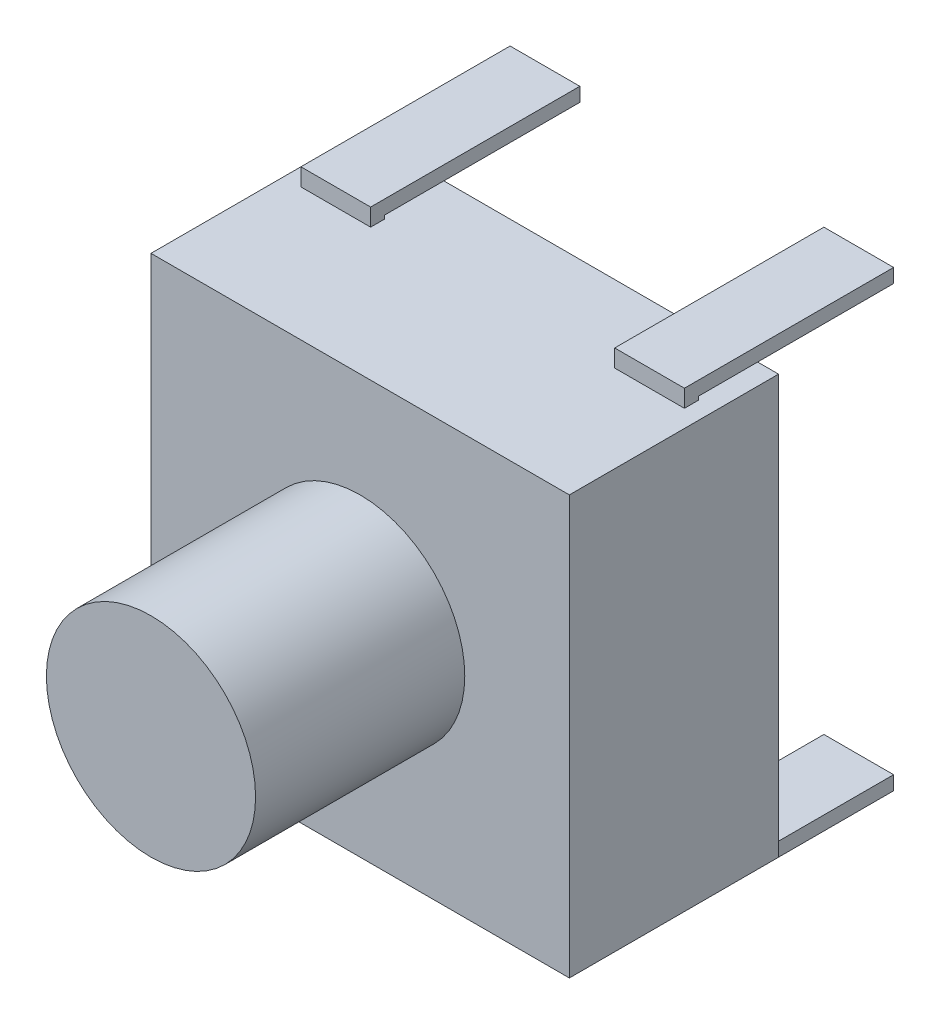
ISO-10303-21;
HEADER;
FILE_DESCRIPTION(('STEP AP214'),'2;1');
FILE_NAME('part.step','',(''),(''),'','','');
FILE_SCHEMA(('AUTOMOTIVE_DESIGN { 1 0 10303 214 1 1 1 1 }'));
ENDSEC;
DATA;
#1=APPLICATION_CONTEXT('core data for automotive mechanical design processes');
#2=APPLICATION_PROTOCOL_DEFINITION('international standard','automotive_design',2000,#1);
#3=PRODUCT_CONTEXT('',#1,'mechanical');
#4=PRODUCT('Part','Part','',(#3));
#5=PRODUCT_RELATED_PRODUCT_CATEGORY('part','',(#4));
#6=PRODUCT_DEFINITION_FORMATION('','',#4);
#7=PRODUCT_DEFINITION_CONTEXT('part definition',#1,'design');
#8=PRODUCT_DEFINITION('design','',#6,#7);
#9=PRODUCT_DEFINITION_SHAPE('','',#8);
#10=(LENGTH_UNIT() NAMED_UNIT(*) SI_UNIT(.MILLI.,.METRE.));
#11=(NAMED_UNIT(*) PLANE_ANGLE_UNIT() SI_UNIT($,.RADIAN.));
#12=(NAMED_UNIT(*) SI_UNIT($,.STERADIAN.) SOLID_ANGLE_UNIT());
#13=UNCERTAINTY_MEASURE_WITH_UNIT(LENGTH_MEASURE(1.E-05),#10,'distance_accuracy_value','');
#14=(GEOMETRIC_REPRESENTATION_CONTEXT(3) GLOBAL_UNCERTAINTY_ASSIGNED_CONTEXT((#13)) GLOBAL_UNIT_ASSIGNED_CONTEXT((#10,
#11,#12)) REPRESENTATION_CONTEXT('',''));
#15=CARTESIAN_POINT('',(0.,0.,0.));
#16=DIRECTION('',(0.,0.,1.));
#17=DIRECTION('',(1.,0.,0.));
#18=AXIS2_PLACEMENT_3D('',#15,#16,#17);
#19=CARTESIAN_POINT('',(-3.00000000000002,3.,3.));
#20=DIRECTION('',(0.,-1.,0.));
#21=DIRECTION('',(0.,0.,-1.));
#22=AXIS2_PLACEMENT_3D('',#19,#20,#21);
#23=PLANE('',#22);
#24=DIRECTION('',(0.,0.,-1.));
#25=VECTOR('',#24,1.);
#26=CARTESIAN_POINT('',(1.75,3.,1.1));
#27=LINE('',#26,#25);
#28=CARTESIAN_POINT('',(1.75,3.,1.1));
#29=VERTEX_POINT('',#28);
#30=CARTESIAN_POINT('',(1.75,3.,0.9));
#31=VERTEX_POINT('',#30);
#32=EDGE_CURVE('E247',#29,#31,#27,.T.);
#33=ORIENTED_EDGE('',*,*,#32,.T.);
#34=DIRECTION('',(1.,0.,0.));
#35=VECTOR('',#34,1.);
#36=CARTESIAN_POINT('',(1.75,3.,0.9));
#37=LINE('',#36,#35);
#38=CARTESIAN_POINT('',(2.75,3.,0.9));
#39=VERTEX_POINT('',#38);
#40=EDGE_CURVE('E59',#31,#39,#37,.T.);
#41=ORIENTED_EDGE('',*,*,#40,.T.);
#42=DIRECTION('',(0.,0.,1.));
#43=VECTOR('',#42,1.);
#44=CARTESIAN_POINT('',(2.75,3.,1.1));
#45=LINE('',#44,#43);
#46=CARTESIAN_POINT('',(2.75,3.,1.1));
#47=VERTEX_POINT('',#46);
#48=EDGE_CURVE('E254',#39,#47,#45,.T.);
#49=ORIENTED_EDGE('',*,*,#48,.T.);
#50=DIRECTION('',(-1.,0.,0.));
#51=VECTOR('',#50,1.);
#52=CARTESIAN_POINT('',(1.75,3.,1.1));
#53=LINE('',#52,#51);
#54=EDGE_CURVE('E236',#47,#29,#53,.T.);
#55=ORIENTED_EDGE('',*,*,#54,.T.);
#56=EDGE_LOOP('',(#33,#41,#49,#55));
#57=FACE_BOUND('',#56,.T.);
#58=DIRECTION('',(-1.,0.,0.));
#59=VECTOR('',#58,1.);
#60=CARTESIAN_POINT('',(-3.00000000000002,3.,0.));
#61=LINE('',#60,#59);
#62=CARTESIAN_POINT('',(3.,3.,0.));
#63=VERTEX_POINT('',#62);
#64=CARTESIAN_POINT('',(-3.00000000000002,3.,0.));
#65=VERTEX_POINT('',#64);
#66=EDGE_CURVE('E524',#63,#65,#61,.T.);
#67=ORIENTED_EDGE('',*,*,#66,.T.);
#68=DIRECTION('',(0.,0.,-1.));
#69=VECTOR('',#68,1.);
#70=CARTESIAN_POINT('',(-3.00000000000002,3.,3.));
#71=LINE('',#70,#69);
#72=CARTESIAN_POINT('',(-3.00000000000002,3.,3.));
#73=VERTEX_POINT('',#72);
#74=EDGE_CURVE('E532',#73,#65,#71,.T.);
#75=ORIENTED_EDGE('',*,*,#74,.F.);
#76=DIRECTION('',(-1.,0.,0.));
#77=VECTOR('',#76,1.);
#78=CARTESIAN_POINT('',(-3.00000000000002,3.,3.));
#79=LINE('',#78,#77);
#80=CARTESIAN_POINT('',(3.,3.,3.));
#81=VERTEX_POINT('',#80);
#82=EDGE_CURVE('E511',#81,#73,#79,.T.);
#83=ORIENTED_EDGE('',*,*,#82,.F.);
#84=DIRECTION('',(0.,0.,-1.));
#85=VECTOR('',#84,1.);
#86=CARTESIAN_POINT('',(3.,3.,3.));
#87=LINE('',#86,#85);
#88=EDGE_CURVE('E536',#81,#63,#87,.T.);
#89=ORIENTED_EDGE('',*,*,#88,.T.);
#90=EDGE_LOOP('',(#67,#75,#83,#89));
#91=FACE_BOUND('',#90,.T.);
#92=DIRECTION('',(0.,0.,-1.));
#93=VECTOR('',#92,1.);
#94=CARTESIAN_POINT('',(-1.75,3.,1.1));
#95=LINE('',#94,#93);
#96=CARTESIAN_POINT('',(-1.75,3.,1.1));
#97=VERTEX_POINT('',#96);
#98=CARTESIAN_POINT('',(-1.75,3.,0.9));
#99=VERTEX_POINT('',#98);
#100=EDGE_CURVE('E67',#97,#99,#95,.T.);
#101=ORIENTED_EDGE('',*,*,#100,.F.);
#102=DIRECTION('',(1.,0.,0.));
#103=VECTOR('',#102,1.);
#104=CARTESIAN_POINT('',(-1.75,3.,1.1));
#105=LINE('',#104,#103);
#106=CARTESIAN_POINT('',(-2.75,3.,1.1));
#107=VERTEX_POINT('',#106);
#108=EDGE_CURVE('E321',#107,#97,#105,.T.);
#109=ORIENTED_EDGE('',*,*,#108,.F.);
#110=DIRECTION('',(0.,0.,1.));
#111=VECTOR('',#110,1.);
#112=CARTESIAN_POINT('',(-2.75,3.,1.1));
#113=LINE('',#112,#111);
#114=CARTESIAN_POINT('',(-2.75,3.,0.9));
#115=VERTEX_POINT('',#114);
#116=EDGE_CURVE('E317',#115,#107,#113,.T.);
#117=ORIENTED_EDGE('',*,*,#116,.F.);
#118=DIRECTION('',(-1.,0.,0.));
#119=VECTOR('',#118,1.);
#120=CARTESIAN_POINT('',(-1.75,3.,0.9));
#121=LINE('',#120,#119);
#122=EDGE_CURVE('E292',#99,#115,#121,.T.);
#123=ORIENTED_EDGE('',*,*,#122,.F.);
#124=EDGE_LOOP('',(#101,#109,#117,#123));
#125=FACE_BOUND('',#124,.T.);
#126=ADVANCED_FACE('F43',(#57,#91,#125),#23,.F.);
#127=CARTESIAN_POINT('',(-3.00000000000002,-3.,3.));
#128=DIRECTION('',(0.,1.,0.));
#129=DIRECTION('',(0.,0.,1.));
#130=AXIS2_PLACEMENT_3D('',#127,#128,#129);
#131=PLANE('',#130);
#132=DIRECTION('',(0.,0.,-1.));
#133=VECTOR('',#132,1.);
#134=CARTESIAN_POINT('',(-1.75,-3.,1.1));
#135=LINE('',#134,#133);
#136=CARTESIAN_POINT('',(-1.75,-3.,1.1));
#137=VERTEX_POINT('',#136);
#138=CARTESIAN_POINT('',(-1.75,-3.,0.9));
#139=VERTEX_POINT('',#138);
#140=EDGE_CURVE('E383',#137,#139,#135,.T.);
#141=ORIENTED_EDGE('',*,*,#140,.T.);
#142=DIRECTION('',(-1.,0.,0.));
#143=VECTOR('',#142,1.);
#144=CARTESIAN_POINT('',(-1.75,-3.,0.9));
#145=LINE('',#144,#143);
#146=CARTESIAN_POINT('',(-2.75,-3.,0.9));
#147=VERTEX_POINT('',#146);
#148=EDGE_CURVE('E298',#139,#147,#145,.T.);
#149=ORIENTED_EDGE('',*,*,#148,.T.);
#150=DIRECTION('',(0.,0.,1.));
#151=VECTOR('',#150,1.);
#152=CARTESIAN_POINT('',(-2.75,-3.,1.1));
#153=LINE('',#152,#151);
#154=CARTESIAN_POINT('',(-2.75,-3.,1.1));
#155=VERTEX_POINT('',#154);
#156=EDGE_CURVE('E390',#147,#155,#153,.T.);
#157=ORIENTED_EDGE('',*,*,#156,.T.);
#158=DIRECTION('',(1.,0.,0.));
#159=VECTOR('',#158,1.);
#160=CARTESIAN_POINT('',(-1.75,-3.,1.1));
#161=LINE('',#160,#159);
#162=EDGE_CURVE('E387',#155,#137,#161,.T.);
#163=ORIENTED_EDGE('',*,*,#162,.T.);
#164=EDGE_LOOP('',(#141,#149,#157,#163));
#165=FACE_BOUND('',#164,.T.);
#166=DIRECTION('',(1.,0.,0.));
#167=VECTOR('',#166,1.);
#168=CARTESIAN_POINT('',(-3.00000000000002,-3.,0.));
#169=LINE('',#168,#167);
#170=CARTESIAN_POINT('',(-3.00000000000002,-3.,0.));
#171=VERTEX_POINT('',#170);
#172=CARTESIAN_POINT('',(3.,-3.,0.));
#173=VERTEX_POINT('',#172);
#174=EDGE_CURVE('E502',#171,#173,#169,.T.);
#175=ORIENTED_EDGE('',*,*,#174,.T.);
#176=DIRECTION('',(0.,0.,-1.));
#177=VECTOR('',#176,1.);
#178=CARTESIAN_POINT('',(3.,-3.,3.));
#179=LINE('',#178,#177);
#180=CARTESIAN_POINT('',(3.,-3.,3.));
#181=VERTEX_POINT('',#180);
#182=EDGE_CURVE('E52',#181,#173,#179,.T.);
#183=ORIENTED_EDGE('',*,*,#182,.F.);
#184=DIRECTION('',(1.,0.,0.));
#185=VECTOR('',#184,1.);
#186=CARTESIAN_POINT('',(-3.00000000000002,-3.,3.));
#187=LINE('',#186,#185);
#188=CARTESIAN_POINT('',(-3.00000000000002,-3.,3.));
#189=VERTEX_POINT('',#188);
#190=EDGE_CURVE('E503',#189,#181,#187,.T.);
#191=ORIENTED_EDGE('',*,*,#190,.F.);
#192=DIRECTION('',(0.,0.,-1.));
#193=VECTOR('',#192,1.);
#194=CARTESIAN_POINT('',(-3.00000000000002,-3.,3.));
#195=LINE('',#194,#193);
#196=EDGE_CURVE('E517',#189,#171,#195,.T.);
#197=ORIENTED_EDGE('',*,*,#196,.T.);
#198=EDGE_LOOP('',(#175,#183,#191,#197));
#199=FACE_BOUND('',#198,.T.);
#200=DIRECTION('',(1.,0.,0.));
#201=VECTOR('',#200,1.);
#202=CARTESIAN_POINT('',(1.75,-3.,0.9));
#203=LINE('',#202,#201);
#204=CARTESIAN_POINT('',(1.75,-3.,0.9));
#205=VERTEX_POINT('',#204);
#206=CARTESIAN_POINT('',(2.75,-3.,0.9));
#207=VERTEX_POINT('',#206);
#208=EDGE_CURVE('E426',#205,#207,#203,.T.);
#209=ORIENTED_EDGE('',*,*,#208,.F.);
#210=DIRECTION('',(0.,0.,-1.));
#211=VECTOR('',#210,1.);
#212=CARTESIAN_POINT('',(1.75,-3.,1.1));
#213=LINE('',#212,#211);
#214=CARTESIAN_POINT('',(1.75,-3.,1.1));
#215=VERTEX_POINT('',#214);
#216=EDGE_CURVE('E458',#215,#205,#213,.T.);
#217=ORIENTED_EDGE('',*,*,#216,.F.);
#218=DIRECTION('',(-1.,0.,0.));
#219=VECTOR('',#218,1.);
#220=CARTESIAN_POINT('',(1.75,-3.,1.1));
#221=LINE('',#220,#219);
#222=CARTESIAN_POINT('',(2.75,-3.,1.1));
#223=VERTEX_POINT('',#222);
#224=EDGE_CURVE('E454',#223,#215,#221,.T.);
#225=ORIENTED_EDGE('',*,*,#224,.F.);
#226=DIRECTION('',(0.,0.,1.));
#227=VECTOR('',#226,1.);
#228=CARTESIAN_POINT('',(2.75,-3.,1.1));
#229=LINE('',#228,#227);
#230=EDGE_CURVE('E450',#207,#223,#229,.T.);
#231=ORIENTED_EDGE('',*,*,#230,.F.);
#232=EDGE_LOOP('',(#209,#217,#225,#231));
#233=FACE_BOUND('',#232,.T.);
#234=ADVANCED_FACE('F45',(#165,#199,#233),#131,.F.);
#235=CARTESIAN_POINT('',(3.,-3.,3.));
#236=DIRECTION('',(0.,0.,-1.));
#237=DIRECTION('',(-1.,0.,0.));
#238=AXIS2_PLACEMENT_3D('',#235,#236,#237);
#239=PLANE('',#238);
#240=ORIENTED_EDGE('',*,*,#190,.T.);
#241=DIRECTION('',(0.,1.,0.));
#242=VECTOR('',#241,1.);
#243=CARTESIAN_POINT('',(3.,3.,3.));
#244=LINE('',#243,#242);
#245=EDGE_CURVE('E507',#181,#81,#244,.T.);
#246=ORIENTED_EDGE('',*,*,#245,.T.);
#247=ORIENTED_EDGE('',*,*,#82,.T.);
#248=DIRECTION('',(0.,-1.,0.));
#249=VECTOR('',#248,1.);
#250=CARTESIAN_POINT('',(-3.00000000000002,3.,3.));
#251=LINE('',#250,#249);
#252=EDGE_CURVE('E514',#73,#189,#251,.T.);
#253=ORIENTED_EDGE('',*,*,#252,.T.);
#254=EDGE_LOOP('',(#240,#246,#247,#253));
#255=FACE_BOUND('',#254,.T.);
#256=CARTESIAN_POINT('',(0.,0.,3.));
#257=DIRECTION('',(0.,0.,-1.));
#258=DIRECTION('',(-1.,0.,0.));
#259=AXIS2_PLACEMENT_3D('',#256,#257,#258);
#260=CIRCLE('',#259,1.5);
#261=CARTESIAN_POINT('',(-1.5,0.,3.));
#262=VERTEX_POINT('',#261);
#263=EDGE_CURVE('E12',#262,#262,#260,.F.);
#264=ORIENTED_EDGE('',*,*,#263,.F.);
#265=EDGE_LOOP('',(#264));
#266=FACE_BOUND('',#265,.T.);
#267=ADVANCED_FACE('F560',(#255,#266),#239,.F.);
#268=CARTESIAN_POINT('',(3.,3.,3.));
#269=DIRECTION('',(-1.,0.,0.));
#270=DIRECTION('',(0.,0.,1.));
#271=AXIS2_PLACEMENT_3D('',#268,#269,#270);
#272=PLANE('',#271);
#273=DIRECTION('',(0.,1.,0.));
#274=VECTOR('',#273,1.);
#275=CARTESIAN_POINT('',(3.,3.,0.));
#276=LINE('',#275,#274);
#277=EDGE_CURVE('E521',#173,#63,#276,.T.);
#278=ORIENTED_EDGE('',*,*,#277,.T.);
#279=ORIENTED_EDGE('',*,*,#88,.F.);
#280=ORIENTED_EDGE('',*,*,#245,.F.);
#281=ORIENTED_EDGE('',*,*,#182,.T.);
#282=EDGE_LOOP('',(#278,#279,#280,#281));
#283=FACE_BOUND('',#282,.T.);
#284=ADVANCED_FACE('F543',(#283),#272,.F.);
#285=CARTESIAN_POINT('',(-3.00000000000002,3.,3.));
#286=DIRECTION('',(1.,0.,0.));
#287=DIRECTION('',(0.,0.,-1.));
#288=AXIS2_PLACEMENT_3D('',#285,#286,#287);
#289=PLANE('',#288);
#290=DIRECTION('',(0.,-1.,0.));
#291=VECTOR('',#290,1.);
#292=CARTESIAN_POINT('',(-3.00000000000002,3.,0.));
#293=LINE('',#292,#291);
#294=EDGE_CURVE('E508',#65,#171,#293,.T.);
#295=ORIENTED_EDGE('',*,*,#294,.T.);
#296=ORIENTED_EDGE('',*,*,#196,.F.);
#297=ORIENTED_EDGE('',*,*,#252,.F.);
#298=ORIENTED_EDGE('',*,*,#74,.T.);
#299=EDGE_LOOP('',(#295,#296,#297,#298));
#300=FACE_BOUND('',#299,.T.);
#301=ADVANCED_FACE('F558',(#300),#289,.F.);
#302=CARTESIAN_POINT('',(3.,-3.,0.));
#303=DIRECTION('',(0.,0.,-1.));
#304=DIRECTION('',(-1.,0.,0.));
#305=AXIS2_PLACEMENT_3D('',#302,#303,#304);
#306=PLANE('',#305);
#307=ORIENTED_EDGE('',*,*,#174,.F.);
#308=ORIENTED_EDGE('',*,*,#294,.F.);
#309=ORIENTED_EDGE('',*,*,#66,.F.);
#310=ORIENTED_EDGE('',*,*,#277,.F.);
#311=EDGE_LOOP('',(#307,#308,#309,#310));
#312=FACE_BOUND('',#311,.T.);
#313=ADVANCED_FACE('F552',(#312),#306,.T.);
#314=CARTESIAN_POINT('',(0.,0.,6.));
#315=DIRECTION('',(0.,0.,-1.));
#316=DIRECTION('',(-1.,0.,0.));
#317=AXIS2_PLACEMENT_3D('',#314,#315,#316);
#318=CYLINDRICAL_SURFACE('',#317,1.5);
#319=CARTESIAN_POINT('',(0.,0.,6.));
#320=DIRECTION('',(0.,0.,1.));
#321=DIRECTION('',(1.,0.,0.));
#322=AXIS2_PLACEMENT_3D('',#319,#320,#321);
#323=CIRCLE('',#322,1.5);
#324=CARTESIAN_POINT('',(1.5,0.,6.));
#325=VERTEX_POINT('',#324);
#326=EDGE_CURVE('E431',#325,#325,#323,.T.);
#327=ORIENTED_EDGE('',*,*,#326,.F.);
#328=EDGE_LOOP('',(#327));
#329=FACE_BOUND('',#328,.T.);
#330=ORIENTED_EDGE('',*,*,#263,.T.);
#331=EDGE_LOOP('',(#330));
#332=FACE_BOUND('',#331,.T.);
#333=ADVANCED_FACE('F566',(#329,#332),#318,.T.);
#334=CARTESIAN_POINT('',(0.,0.,6.));
#335=DIRECTION('',(0.,0.,1.));
#336=DIRECTION('',(1.,0.,0.));
#337=AXIS2_PLACEMENT_3D('',#334,#335,#336);
#338=PLANE('',#337);
#339=ORIENTED_EDGE('',*,*,#326,.T.);
#340=EDGE_LOOP('',(#339));
#341=FACE_BOUND('',#340,.T.);
#342=ADVANCED_FACE('F568',(#341),#338,.T.);
#343=CARTESIAN_POINT('',(1.75,-3.25,1.1));
#344=DIRECTION('',(0.,-1.,0.));
#345=DIRECTION('',(1.,0.,0.));
#346=AXIS2_PLACEMENT_3D('',#343,#344,#345);
#347=PLANE('',#346);
#348=DIRECTION('',(0.,0.,-1.));
#349=VECTOR('',#348,1.);
#350=CARTESIAN_POINT('',(1.75,-3.25,1.1));
#351=LINE('',#350,#349);
#352=CARTESIAN_POINT('',(1.75,-3.25,1.1));
#353=VERTEX_POINT('',#352);
#354=CARTESIAN_POINT('',(1.75,-3.25,-1.9));
#355=VERTEX_POINT('',#354);
#356=EDGE_CURVE('E480',#353,#355,#351,.T.);
#357=ORIENTED_EDGE('',*,*,#356,.T.);
#358=DIRECTION('',(1.,0.,0.));
#359=VECTOR('',#358,1.);
#360=CARTESIAN_POINT('',(1.75,-3.25,-1.9));
#361=LINE('',#360,#359);
#362=CARTESIAN_POINT('',(2.75,-3.25,-1.9));
#363=VERTEX_POINT('',#362);
#364=EDGE_CURVE('E432',#355,#363,#361,.T.);
#365=ORIENTED_EDGE('',*,*,#364,.T.);
#366=DIRECTION('',(0.,0.,-1.));
#367=VECTOR('',#366,1.);
#368=CARTESIAN_POINT('',(2.75,-3.25,1.1));
#369=LINE('',#368,#367);
#370=CARTESIAN_POINT('',(2.75,-3.25,1.1));
#371=VERTEX_POINT('',#370);
#372=EDGE_CURVE('E484',#371,#363,#369,.T.);
#373=ORIENTED_EDGE('',*,*,#372,.F.);
#374=DIRECTION('',(-1.,0.,0.));
#375=VECTOR('',#374,1.);
#376=CARTESIAN_POINT('',(1.75,-3.25,1.1));
#377=LINE('',#376,#375);
#378=EDGE_CURVE('E441',#371,#353,#377,.T.);
#379=ORIENTED_EDGE('',*,*,#378,.T.);
#380=EDGE_LOOP('',(#357,#365,#373,#379));
#381=FACE_BOUND('',#380,.T.);
#382=ADVANCED_FACE('F575',(#381),#347,.T.);
#383=CARTESIAN_POINT('',(1.75,-3.05,0.9));
#384=DIRECTION('',(0.,1.,0.));
#385=DIRECTION('',(0.,0.,1.));
#386=AXIS2_PLACEMENT_3D('',#383,#384,#385);
#387=PLANE('',#386);
#388=DIRECTION('',(0.,0.,-1.));
#389=VECTOR('',#388,1.);
#390=CARTESIAN_POINT('',(2.75,-3.05,0.9));
#391=LINE('',#390,#389);
#392=CARTESIAN_POINT('',(2.75,-3.05,0.9));
#393=VERTEX_POINT('',#392);
#394=CARTESIAN_POINT('',(2.75,-3.05,-1.9));
#395=VERTEX_POINT('',#394);
#396=EDGE_CURVE('E488',#393,#395,#391,.T.);
#397=ORIENTED_EDGE('',*,*,#396,.T.);
#398=DIRECTION('',(-1.,0.,0.));
#399=VECTOR('',#398,1.);
#400=CARTESIAN_POINT('',(1.75,-3.05,-1.9));
#401=LINE('',#400,#399);
#402=CARTESIAN_POINT('',(1.75,-3.05,-1.9));
#403=VERTEX_POINT('',#402);
#404=EDGE_CURVE('E440',#395,#403,#401,.T.);
#405=ORIENTED_EDGE('',*,*,#404,.T.);
#406=DIRECTION('',(0.,0.,-1.));
#407=VECTOR('',#406,1.);
#408=CARTESIAN_POINT('',(1.75,-3.05,0.9));
#409=LINE('',#408,#407);
#410=CARTESIAN_POINT('',(1.75,-3.05,0.9));
#411=VERTEX_POINT('',#410);
#412=EDGE_CURVE('E492',#411,#403,#409,.T.);
#413=ORIENTED_EDGE('',*,*,#412,.F.);
#414=DIRECTION('',(1.,0.,0.));
#415=VECTOR('',#414,1.);
#416=CARTESIAN_POINT('',(1.75,-3.05,0.9));
#417=LINE('',#416,#415);
#418=EDGE_CURVE('E445',#411,#393,#417,.T.);
#419=ORIENTED_EDGE('',*,*,#418,.T.);
#420=EDGE_LOOP('',(#397,#405,#413,#419));
#421=FACE_BOUND('',#420,.T.);
#422=ADVANCED_FACE('F612',(#421),#387,.T.);
#423=CARTESIAN_POINT('',(1.75,-4.16980390271856,1.1));
#424=DIRECTION('',(1.,0.,0.));
#425=DIRECTION('',(0.,0.,-1.));
#426=AXIS2_PLACEMENT_3D('',#423,#424,#425);
#427=PLANE('',#426);
#428=DIRECTION('',(0.,1.,0.));
#429=VECTOR('',#428,1.);
#430=CARTESIAN_POINT('',(1.75,-4.16980390271856,0.900000000000001));
#431=LINE('',#430,#429);
#432=EDGE_CURVE('E462',#411,#205,#431,.T.);
#433=ORIENTED_EDGE('',*,*,#432,.F.);
#434=ORIENTED_EDGE('',*,*,#412,.T.);
#435=DIRECTION('',(0.,-1.,0.));
#436=VECTOR('',#435,1.);
#437=CARTESIAN_POINT('',(1.75,-3.70990195135928,-1.9));
#438=LINE('',#437,#436);
#439=EDGE_CURVE('E436',#403,#355,#438,.T.);
#440=ORIENTED_EDGE('',*,*,#439,.T.);
#441=ORIENTED_EDGE('',*,*,#356,.F.);
#442=DIRECTION('',(0.,1.,0.));
#443=VECTOR('',#442,1.);
#444=CARTESIAN_POINT('',(1.75,-4.16980390271856,1.1));
#445=LINE('',#444,#443);
#446=EDGE_CURVE('E466',#353,#215,#445,.T.);
#447=ORIENTED_EDGE('',*,*,#446,.T.);
#448=ORIENTED_EDGE('',*,*,#216,.T.);
#449=EDGE_LOOP('',(#433,#434,#440,#441,#447,#448));
#450=FACE_BOUND('',#449,.T.);
#451=ADVANCED_FACE('F621',(#450),#427,.F.);
#452=CARTESIAN_POINT('',(1.75,-4.16980390271856,1.1));
#453=DIRECTION('',(0.,0.,-1.));
#454=DIRECTION('',(0.,1.,0.));
#455=AXIS2_PLACEMENT_3D('',#452,#453,#454);
#456=PLANE('',#455);
#457=ORIENTED_EDGE('',*,*,#378,.F.);
#458=DIRECTION('',(0.,1.,0.));
#459=VECTOR('',#458,1.);
#460=CARTESIAN_POINT('',(2.75,-4.16980390271856,1.1));
#461=LINE('',#460,#459);
#462=EDGE_CURVE('E470',#371,#223,#461,.T.);
#463=ORIENTED_EDGE('',*,*,#462,.T.);
#464=ORIENTED_EDGE('',*,*,#224,.T.);
#465=ORIENTED_EDGE('',*,*,#446,.F.);
#466=EDGE_LOOP('',(#457,#463,#464,#465));
#467=FACE_BOUND('',#466,.T.);
#468=ADVANCED_FACE('F630',(#467),#456,.F.);
#469=CARTESIAN_POINT('',(2.75,-4.16980390271856,1.1));
#470=DIRECTION('',(-1.,0.,0.));
#471=DIRECTION('',(0.,0.,1.));
#472=AXIS2_PLACEMENT_3D('',#469,#470,#471);
#473=PLANE('',#472);
#474=ORIENTED_EDGE('',*,*,#462,.F.);
#475=ORIENTED_EDGE('',*,*,#372,.T.);
#476=DIRECTION('',(0.,1.,0.));
#477=VECTOR('',#476,1.);
#478=CARTESIAN_POINT('',(2.75,-3.70990195135928,-1.9));
#479=LINE('',#478,#477);
#480=EDGE_CURVE('E427',#363,#395,#479,.T.);
#481=ORIENTED_EDGE('',*,*,#480,.T.);
#482=ORIENTED_EDGE('',*,*,#396,.F.);
#483=DIRECTION('',(0.,1.,0.));
#484=VECTOR('',#483,1.);
#485=CARTESIAN_POINT('',(2.75,-4.16980390271856,0.900000000000001));
#486=LINE('',#485,#484);
#487=EDGE_CURVE('E446',#393,#207,#486,.T.);
#488=ORIENTED_EDGE('',*,*,#487,.T.);
#489=ORIENTED_EDGE('',*,*,#230,.T.);
#490=EDGE_LOOP('',(#474,#475,#481,#482,#488,#489));
#491=FACE_BOUND('',#490,.T.);
#492=ADVANCED_FACE('F639',(#491),#473,.F.);
#493=CARTESIAN_POINT('',(1.75,-4.16980390271856,0.900000000000001));
#494=DIRECTION('',(0.,0.,1.));
#495=DIRECTION('',(0.,-1.,0.));
#496=AXIS2_PLACEMENT_3D('',#493,#494,#495);
#497=PLANE('',#496);
#498=ORIENTED_EDGE('',*,*,#418,.F.);
#499=ORIENTED_EDGE('',*,*,#432,.T.);
#500=ORIENTED_EDGE('',*,*,#208,.T.);
#501=ORIENTED_EDGE('',*,*,#487,.F.);
#502=EDGE_LOOP('',(#498,#499,#500,#501));
#503=FACE_BOUND('',#502,.T.);
#504=ADVANCED_FACE('F648',(#503),#497,.F.);
#505=CARTESIAN_POINT('',(2.25,-3.15,-1.9));
#506=DIRECTION('',(0.,0.,-1.));
#507=DIRECTION('',(0.,1.,0.));
#508=AXIS2_PLACEMENT_3D('',#505,#506,#507);
#509=PLANE('',#508);
#510=ORIENTED_EDGE('',*,*,#404,.F.);
#511=ORIENTED_EDGE('',*,*,#480,.F.);
#512=ORIENTED_EDGE('',*,*,#364,.F.);
#513=ORIENTED_EDGE('',*,*,#439,.F.);
#514=EDGE_LOOP('',(#510,#511,#512,#513));
#515=FACE_BOUND('',#514,.T.);
#516=ADVANCED_FACE('F657',(#515),#509,.T.);
#517=CARTESIAN_POINT('',(-1.75,-3.25,1.1));
#518=DIRECTION('',(0.,1.,0.));
#519=DIRECTION('',(-1.,0.,0.));
#520=AXIS2_PLACEMENT_3D('',#517,#518,#519);
#521=PLANE('',#520);
#522=DIRECTION('',(-1.,0.,0.));
#523=VECTOR('',#522,1.);
#524=CARTESIAN_POINT('',(-1.75,-3.25,-1.9));
#525=LINE('',#524,#523);
#526=CARTESIAN_POINT('',(-1.75,-3.25,-1.9));
#527=VERTEX_POINT('',#526);
#528=CARTESIAN_POINT('',(-2.75,-3.25,-1.9));
#529=VERTEX_POINT('',#528);
#530=EDGE_CURVE('E370',#527,#529,#525,.T.);
#531=ORIENTED_EDGE('',*,*,#530,.F.);
#532=DIRECTION('',(0.,0.,-1.));
#533=VECTOR('',#532,1.);
#534=CARTESIAN_POINT('',(-1.75,-3.25,1.1));
#535=LINE('',#534,#533);
#536=CARTESIAN_POINT('',(-1.75,-3.25,1.1));
#537=VERTEX_POINT('',#536);
#538=EDGE_CURVE('E378',#537,#527,#535,.T.);
#539=ORIENTED_EDGE('',*,*,#538,.F.);
#540=DIRECTION('',(1.,0.,0.));
#541=VECTOR('',#540,1.);
#542=CARTESIAN_POINT('',(-1.75,-3.25,1.1));
#543=LINE('',#542,#541);
#544=CARTESIAN_POINT('',(-2.75,-3.25,1.1));
#545=VERTEX_POINT('',#544);
#546=EDGE_CURVE('E374',#545,#537,#543,.T.);
#547=ORIENTED_EDGE('',*,*,#546,.F.);
#548=DIRECTION('',(0.,0.,-1.));
#549=VECTOR('',#548,1.);
#550=CARTESIAN_POINT('',(-2.75,-3.25,1.1));
#551=LINE('',#550,#549);
#552=EDGE_CURVE('E367',#545,#529,#551,.T.);
#553=ORIENTED_EDGE('',*,*,#552,.T.);
#554=EDGE_LOOP('',(#531,#539,#547,#553));
#555=FACE_BOUND('',#554,.T.);
#556=ADVANCED_FACE('F666',(#555),#521,.F.);
#557=CARTESIAN_POINT('',(-1.75,-3.05,0.9));
#558=DIRECTION('',(0.,-1.,0.));
#559=DIRECTION('',(0.,0.,-1.));
#560=AXIS2_PLACEMENT_3D('',#557,#558,#559);
#561=PLANE('',#560);
#562=DIRECTION('',(1.,0.,0.));
#563=VECTOR('',#562,1.);
#564=CARTESIAN_POINT('',(-1.75,-3.05,-1.9));
#565=LINE('',#564,#563);
#566=CARTESIAN_POINT('',(-2.75,-3.05,-1.9));
#567=VERTEX_POINT('',#566);
#568=CARTESIAN_POINT('',(-1.75,-3.05,-1.9));
#569=VERTEX_POINT('',#568);
#570=EDGE_CURVE('E363',#567,#569,#565,.T.);
#571=ORIENTED_EDGE('',*,*,#570,.F.);
#572=DIRECTION('',(0.,0.,-1.));
#573=VECTOR('',#572,1.);
#574=CARTESIAN_POINT('',(-2.75,-3.05,0.9));
#575=LINE('',#574,#573);
#576=CARTESIAN_POINT('',(-2.75,-3.05,0.9));
#577=VERTEX_POINT('',#576);
#578=EDGE_CURVE('E417',#577,#567,#575,.T.);
#579=ORIENTED_EDGE('',*,*,#578,.F.);
#580=DIRECTION('',(-1.,0.,0.));
#581=VECTOR('',#580,1.);
#582=CARTESIAN_POINT('',(-1.75,-3.05,0.9));
#583=LINE('',#582,#581);
#584=CARTESIAN_POINT('',(-1.75,-3.05,0.9));
#585=VERTEX_POINT('',#584);
#586=EDGE_CURVE('E379',#585,#577,#583,.T.);
#587=ORIENTED_EDGE('',*,*,#586,.F.);
#588=DIRECTION('',(0.,0.,-1.));
#589=VECTOR('',#588,1.);
#590=CARTESIAN_POINT('',(-1.75,-3.05,0.9));
#591=LINE('',#590,#589);
#592=EDGE_CURVE('E413',#585,#569,#591,.T.);
#593=ORIENTED_EDGE('',*,*,#592,.T.);
#594=EDGE_LOOP('',(#571,#579,#587,#593));
#595=FACE_BOUND('',#594,.T.);
#596=ADVANCED_FACE('F676',(#595),#561,.F.);
#597=CARTESIAN_POINT('',(-1.75,-4.16980390271856,0.900000000000001));
#598=DIRECTION('',(0.,0.,-1.));
#599=DIRECTION('',(0.,1.,0.));
#600=AXIS2_PLACEMENT_3D('',#597,#598,#599);
#601=PLANE('',#600);
#602=DIRECTION('',(0.,1.,0.));
#603=VECTOR('',#602,1.);
#604=CARTESIAN_POINT('',(-1.75,-4.16980390271856,0.900000000000001));
#605=LINE('',#604,#603);
#606=EDGE_CURVE('E403',#585,#139,#605,.T.);
#607=ORIENTED_EDGE('',*,*,#606,.F.);
#608=ORIENTED_EDGE('',*,*,#586,.T.);
#609=DIRECTION('',(0.,1.,0.));
#610=VECTOR('',#609,1.);
#611=CARTESIAN_POINT('',(-2.75,-4.16980390271856,0.900000000000001));
#612=LINE('',#611,#610);
#613=EDGE_CURVE('E394',#577,#147,#612,.T.);
#614=ORIENTED_EDGE('',*,*,#613,.T.);
#615=ORIENTED_EDGE('',*,*,#148,.F.);
#616=EDGE_LOOP('',(#607,#608,#614,#615));
#617=FACE_BOUND('',#616,.T.);
#618=ADVANCED_FACE('F685',(#617),#601,.T.);
#619=CARTESIAN_POINT('',(-2.75,-4.16980390271856,1.1));
#620=DIRECTION('',(-1.,0.,0.));
#621=DIRECTION('',(0.,0.,1.));
#622=AXIS2_PLACEMENT_3D('',#619,#620,#621);
#623=PLANE('',#622);
#624=ORIENTED_EDGE('',*,*,#613,.F.);
#625=ORIENTED_EDGE('',*,*,#578,.T.);
#626=DIRECTION('',(0.,1.,0.));
#627=VECTOR('',#626,1.);
#628=CARTESIAN_POINT('',(-2.75,-3.70990195135928,-1.9));
#629=LINE('',#628,#627);
#630=EDGE_CURVE('E373',#529,#567,#629,.T.);
#631=ORIENTED_EDGE('',*,*,#630,.F.);
#632=ORIENTED_EDGE('',*,*,#552,.F.);
#633=DIRECTION('',(0.,1.,0.));
#634=VECTOR('',#633,1.);
#635=CARTESIAN_POINT('',(-2.75,-4.16980390271856,1.1));
#636=LINE('',#635,#634);
#637=EDGE_CURVE('E397',#545,#155,#636,.T.);
#638=ORIENTED_EDGE('',*,*,#637,.T.);
#639=ORIENTED_EDGE('',*,*,#156,.F.);
#640=EDGE_LOOP('',(#624,#625,#631,#632,#638,#639));
#641=FACE_BOUND('',#640,.T.);
#642=ADVANCED_FACE('F694',(#641),#623,.T.);
#643=CARTESIAN_POINT('',(-1.75,-4.16980390271856,1.1));
#644=DIRECTION('',(0.,0.,1.));
#645=DIRECTION('',(0.,-1.,0.));
#646=AXIS2_PLACEMENT_3D('',#643,#644,#645);
#647=PLANE('',#646);
#648=ORIENTED_EDGE('',*,*,#637,.F.);
#649=ORIENTED_EDGE('',*,*,#546,.T.);
#650=DIRECTION('',(0.,1.,0.));
#651=VECTOR('',#650,1.);
#652=CARTESIAN_POINT('',(-1.75,-4.16980390271856,1.1));
#653=LINE('',#652,#651);
#654=EDGE_CURVE('E400',#537,#137,#653,.T.);
#655=ORIENTED_EDGE('',*,*,#654,.T.);
#656=ORIENTED_EDGE('',*,*,#162,.F.);
#657=EDGE_LOOP('',(#648,#649,#655,#656));
#658=FACE_BOUND('',#657,.T.);
#659=ADVANCED_FACE('F703',(#658),#647,.T.);
#660=CARTESIAN_POINT('',(-1.75,-4.16980390271856,1.1));
#661=DIRECTION('',(1.,0.,0.));
#662=DIRECTION('',(0.,0.,-1.));
#663=AXIS2_PLACEMENT_3D('',#660,#661,#662);
#664=PLANE('',#663);
#665=ORIENTED_EDGE('',*,*,#654,.F.);
#666=ORIENTED_EDGE('',*,*,#538,.T.);
#667=DIRECTION('',(0.,-1.,0.));
#668=VECTOR('',#667,1.);
#669=CARTESIAN_POINT('',(-1.75,-3.70990195135928,-1.9));
#670=LINE('',#669,#668);
#671=EDGE_CURVE('E366',#569,#527,#670,.T.);
#672=ORIENTED_EDGE('',*,*,#671,.F.);
#673=ORIENTED_EDGE('',*,*,#592,.F.);
#674=ORIENTED_EDGE('',*,*,#606,.T.);
#675=ORIENTED_EDGE('',*,*,#140,.F.);
#676=EDGE_LOOP('',(#665,#666,#672,#673,#674,#675));
#677=FACE_BOUND('',#676,.T.);
#678=ADVANCED_FACE('F712',(#677),#664,.T.);
#679=CARTESIAN_POINT('',(-2.25,-3.15,-1.9));
#680=DIRECTION('',(0.,0.,-1.));
#681=DIRECTION('',(0.,1.,0.));
#682=AXIS2_PLACEMENT_3D('',#679,#680,#681);
#683=PLANE('',#682);
#684=ORIENTED_EDGE('',*,*,#530,.T.);
#685=ORIENTED_EDGE('',*,*,#630,.T.);
#686=ORIENTED_EDGE('',*,*,#570,.T.);
#687=ORIENTED_EDGE('',*,*,#671,.T.);
#688=EDGE_LOOP('',(#684,#685,#686,#687));
#689=FACE_BOUND('',#688,.T.);
#690=ADVANCED_FACE('F721',(#689),#683,.T.);
#691=CARTESIAN_POINT('',(-1.75,3.25,1.1));
#692=DIRECTION('',(0.,1.,0.));
#693=DIRECTION('',(-1.,0.,0.));
#694=AXIS2_PLACEMENT_3D('',#691,#692,#693);
#695=PLANE('',#694);
#696=DIRECTION('',(0.,0.,-1.));
#697=VECTOR('',#696,1.);
#698=CARTESIAN_POINT('',(-1.75,3.25,1.1));
#699=LINE('',#698,#697);
#700=CARTESIAN_POINT('',(-1.75,3.25,1.1));
#701=VERTEX_POINT('',#700);
#702=CARTESIAN_POINT('',(-1.75,3.25,-1.9));
#703=VERTEX_POINT('',#702);
#704=EDGE_CURVE('E344',#701,#703,#699,.T.);
#705=ORIENTED_EDGE('',*,*,#704,.T.);
#706=DIRECTION('',(-1.,0.,0.));
#707=VECTOR('',#706,1.);
#708=CARTESIAN_POINT('',(-1.75,3.25,-1.9));
#709=LINE('',#708,#707);
#710=CARTESIAN_POINT('',(-2.75,3.25,-1.9));
#711=VERTEX_POINT('',#710);
#712=EDGE_CURVE('E299',#703,#711,#709,.T.);
#713=ORIENTED_EDGE('',*,*,#712,.T.);
#714=DIRECTION('',(0.,0.,-1.));
#715=VECTOR('',#714,1.);
#716=CARTESIAN_POINT('',(-2.75,3.25,1.1));
#717=LINE('',#716,#715);
#718=CARTESIAN_POINT('',(-2.75,3.25,1.1));
#719=VERTEX_POINT('',#718);
#720=EDGE_CURVE('E348',#719,#711,#717,.T.);
#721=ORIENTED_EDGE('',*,*,#720,.F.);
#722=DIRECTION('',(1.,0.,0.));
#723=VECTOR('',#722,1.);
#724=CARTESIAN_POINT('',(-1.75,3.25,1.1));
#725=LINE('',#724,#723);
#726=EDGE_CURVE('E308',#719,#701,#725,.T.);
#727=ORIENTED_EDGE('',*,*,#726,.T.);
#728=EDGE_LOOP('',(#705,#713,#721,#727));
#729=FACE_BOUND('',#728,.T.);
#730=ADVANCED_FACE('F730',(#729),#695,.T.);
#731=CARTESIAN_POINT('',(-1.75,3.05,0.9));
#732=DIRECTION('',(0.,-1.,0.));
#733=DIRECTION('',(0.,0.,-1.));
#734=AXIS2_PLACEMENT_3D('',#731,#732,#733);
#735=PLANE('',#734);
#736=DIRECTION('',(0.,0.,-1.));
#737=VECTOR('',#736,1.);
#738=CARTESIAN_POINT('',(-2.75,3.05,0.9));
#739=LINE('',#738,#737);
#740=CARTESIAN_POINT('',(-2.75,3.05,0.9));
#741=VERTEX_POINT('',#740);
#742=CARTESIAN_POINT('',(-2.75,3.05,-1.9));
#743=VERTEX_POINT('',#742);
#744=EDGE_CURVE('E352',#741,#743,#739,.T.);
#745=ORIENTED_EDGE('',*,*,#744,.T.);
#746=DIRECTION('',(1.,0.,0.));
#747=VECTOR('',#746,1.);
#748=CARTESIAN_POINT('',(-1.75,3.05,-1.9));
#749=LINE('',#748,#747);
#750=CARTESIAN_POINT('',(-1.75,3.05,-1.9));
#751=VERTEX_POINT('',#750);
#752=EDGE_CURVE('E307',#743,#751,#749,.T.);
#753=ORIENTED_EDGE('',*,*,#752,.T.);
#754=DIRECTION('',(0.,0.,-1.));
#755=VECTOR('',#754,1.);
#756=CARTESIAN_POINT('',(-1.75,3.05,0.9));
#757=LINE('',#756,#755);
#758=CARTESIAN_POINT('',(-1.75,3.05,0.9));
#759=VERTEX_POINT('',#758);
#760=EDGE_CURVE('E356',#759,#751,#757,.T.);
#761=ORIENTED_EDGE('',*,*,#760,.F.);
#762=DIRECTION('',(-1.,0.,0.));
#763=VECTOR('',#762,1.);
#764=CARTESIAN_POINT('',(-1.75,3.05,0.9));
#765=LINE('',#764,#763);
#766=EDGE_CURVE('E312',#759,#741,#765,.T.);
#767=ORIENTED_EDGE('',*,*,#766,.T.);
#768=EDGE_LOOP('',(#745,#753,#761,#767));
#769=FACE_BOUND('',#768,.T.);
#770=ADVANCED_FACE('F740',(#769),#735,.T.);
#771=CARTESIAN_POINT('',(-1.75,4.16980390271856,1.1));
#772=DIRECTION('',(-1.,0.,0.));
#773=DIRECTION('',(0.,0.,1.));
#774=AXIS2_PLACEMENT_3D('',#771,#772,#773);
#775=PLANE('',#774);
#776=DIRECTION('',(0.,-1.,0.));
#777=VECTOR('',#776,1.);
#778=CARTESIAN_POINT('',(-1.75,4.16980390271856,0.900000000000001));
#779=LINE('',#778,#777);
#780=EDGE_CURVE('E327',#759,#99,#779,.T.);
#781=ORIENTED_EDGE('',*,*,#780,.F.);
#782=ORIENTED_EDGE('',*,*,#760,.T.);
#783=DIRECTION('',(0.,1.,0.));
#784=VECTOR('',#783,1.);
#785=CARTESIAN_POINT('',(-1.75,3.70990195135928,-1.9));
#786=LINE('',#785,#784);
#787=EDGE_CURVE('E303',#751,#703,#786,.T.);
#788=ORIENTED_EDGE('',*,*,#787,.T.);
#789=ORIENTED_EDGE('',*,*,#704,.F.);
#790=DIRECTION('',(0.,-1.,0.));
#791=VECTOR('',#790,1.);
#792=CARTESIAN_POINT('',(-1.75,4.16980390271856,1.1));
#793=LINE('',#792,#791);
#794=EDGE_CURVE('E331',#701,#97,#793,.T.);
#795=ORIENTED_EDGE('',*,*,#794,.T.);
#796=ORIENTED_EDGE('',*,*,#100,.T.);
#797=EDGE_LOOP('',(#781,#782,#788,#789,#795,#796));
#798=FACE_BOUND('',#797,.T.);
#799=ADVANCED_FACE('F749',(#798),#775,.F.);
#800=CARTESIAN_POINT('',(-1.75,4.16980390271856,1.1));
#801=DIRECTION('',(0.,0.,-1.));
#802=DIRECTION('',(0.,1.,0.));
#803=AXIS2_PLACEMENT_3D('',#800,#801,#802);
#804=PLANE('',#803);
#805=ORIENTED_EDGE('',*,*,#726,.F.);
#806=DIRECTION('',(0.,-1.,0.));
#807=VECTOR('',#806,1.);
#808=CARTESIAN_POINT('',(-2.75,4.16980390271856,1.1));
#809=LINE('',#808,#807);
#810=EDGE_CURVE('E334',#719,#107,#809,.T.);
#811=ORIENTED_EDGE('',*,*,#810,.T.);
#812=ORIENTED_EDGE('',*,*,#108,.T.);
#813=ORIENTED_EDGE('',*,*,#794,.F.);
#814=EDGE_LOOP('',(#805,#811,#812,#813));
#815=FACE_BOUND('',#814,.T.);
#816=ADVANCED_FACE('F758',(#815),#804,.F.);
#817=CARTESIAN_POINT('',(-2.75,4.16980390271856,1.1));
#818=DIRECTION('',(1.,0.,0.));
#819=DIRECTION('',(0.,0.,-1.));
#820=AXIS2_PLACEMENT_3D('',#817,#818,#819);
#821=PLANE('',#820);
#822=ORIENTED_EDGE('',*,*,#810,.F.);
#823=ORIENTED_EDGE('',*,*,#720,.T.);
#824=DIRECTION('',(0.,-1.,0.));
#825=VECTOR('',#824,1.);
#826=CARTESIAN_POINT('',(-2.75,3.70990195135928,-1.9));
#827=LINE('',#826,#825);
#828=EDGE_CURVE('E294',#711,#743,#827,.T.);
#829=ORIENTED_EDGE('',*,*,#828,.T.);
#830=ORIENTED_EDGE('',*,*,#744,.F.);
#831=DIRECTION('',(0.,-1.,0.));
#832=VECTOR('',#831,1.);
#833=CARTESIAN_POINT('',(-2.75,4.16980390271856,0.900000000000001));
#834=LINE('',#833,#832);
#835=EDGE_CURVE('E313',#741,#115,#834,.T.);
#836=ORIENTED_EDGE('',*,*,#835,.T.);
#837=ORIENTED_EDGE('',*,*,#116,.T.);
#838=EDGE_LOOP('',(#822,#823,#829,#830,#836,#837));
#839=FACE_BOUND('',#838,.T.);
#840=ADVANCED_FACE('F767',(#839),#821,.F.);
#841=CARTESIAN_POINT('',(-1.75,4.16980390271856,0.900000000000001));
#842=DIRECTION('',(0.,0.,1.));
#843=DIRECTION('',(0.,-1.,0.));
#844=AXIS2_PLACEMENT_3D('',#841,#842,#843);
#845=PLANE('',#844);
#846=ORIENTED_EDGE('',*,*,#766,.F.);
#847=ORIENTED_EDGE('',*,*,#780,.T.);
#848=ORIENTED_EDGE('',*,*,#122,.T.);
#849=ORIENTED_EDGE('',*,*,#835,.F.);
#850=EDGE_LOOP('',(#846,#847,#848,#849));
#851=FACE_BOUND('',#850,.T.);
#852=ADVANCED_FACE('F776',(#851),#845,.F.);
#853=CARTESIAN_POINT('',(-2.25,3.15,-1.9));
#854=DIRECTION('',(0.,0.,-1.));
#855=DIRECTION('',(0.,1.,0.));
#856=AXIS2_PLACEMENT_3D('',#853,#854,#855);
#857=PLANE('',#856);
#858=ORIENTED_EDGE('',*,*,#752,.F.);
#859=ORIENTED_EDGE('',*,*,#828,.F.);
#860=ORIENTED_EDGE('',*,*,#712,.F.);
#861=ORIENTED_EDGE('',*,*,#787,.F.);
#862=EDGE_LOOP('',(#858,#859,#860,#861));
#863=FACE_BOUND('',#862,.T.);
#864=ADVANCED_FACE('F785',(#863),#857,.T.);
#865=CARTESIAN_POINT('',(1.75,3.25,1.1));
#866=DIRECTION('',(0.,-1.,0.));
#867=DIRECTION('',(1.,0.,0.));
#868=AXIS2_PLACEMENT_3D('',#865,#866,#867);
#869=PLANE('',#868);
#870=DIRECTION('',(1.,0.,0.));
#871=VECTOR('',#870,1.);
#872=CARTESIAN_POINT('',(1.75,3.25,-1.9));
#873=LINE('',#872,#871);
#874=CARTESIAN_POINT('',(1.75,3.25,-1.9));
#875=VERTEX_POINT('',#874);
#876=CARTESIAN_POINT('',(2.75,3.25,-1.9));
#877=VERTEX_POINT('',#876);
#878=EDGE_CURVE('E293',#875,#877,#873,.T.);
#879=ORIENTED_EDGE('',*,*,#878,.F.);
#880=DIRECTION('',(0.,0.,-1.));
#881=VECTOR('',#880,1.);
#882=CARTESIAN_POINT('',(1.75,3.25,1.1));
#883=LINE('',#882,#881);
#884=CARTESIAN_POINT('',(1.75,3.25,1.1));
#885=VERTEX_POINT('',#884);
#886=EDGE_CURVE('E273',#885,#875,#883,.T.);
#887=ORIENTED_EDGE('',*,*,#886,.F.);
#888=DIRECTION('',(-1.,0.,0.));
#889=VECTOR('',#888,1.);
#890=CARTESIAN_POINT('',(1.75,3.25,1.1));
#891=LINE('',#890,#889);
#892=CARTESIAN_POINT('',(2.75,3.25,1.1));
#893=VERTEX_POINT('',#892);
#894=EDGE_CURVE('E239',#893,#885,#891,.T.);
#895=ORIENTED_EDGE('',*,*,#894,.F.);
#896=DIRECTION('',(0.,0.,-1.));
#897=VECTOR('',#896,1.);
#898=CARTESIAN_POINT('',(2.75,3.25,1.1));
#899=LINE('',#898,#897);
#900=EDGE_CURVE('E284',#893,#877,#899,.T.);
#901=ORIENTED_EDGE('',*,*,#900,.T.);
#902=EDGE_LOOP('',(#879,#887,#895,#901));
#903=FACE_BOUND('',#902,.T.);
#904=ADVANCED_FACE('F794',(#903),#869,.F.);
#905=CARTESIAN_POINT('',(1.75,3.05,0.9));
#906=DIRECTION('',(0.,1.,0.));
#907=DIRECTION('',(0.,0.,1.));
#908=AXIS2_PLACEMENT_3D('',#905,#906,#907);
#909=PLANE('',#908);
#910=DIRECTION('',(-1.,0.,0.));
#911=VECTOR('',#910,1.);
#912=CARTESIAN_POINT('',(1.75,3.05,-1.9));
#913=LINE('',#912,#911);
#914=CARTESIAN_POINT('',(2.75,3.05,-1.9));
#915=VERTEX_POINT('',#914);
#916=CARTESIAN_POINT('',(1.75,3.05,-1.9));
#917=VERTEX_POINT('',#916);
#918=EDGE_CURVE('E288',#915,#917,#913,.T.);
#919=ORIENTED_EDGE('',*,*,#918,.F.);
#920=DIRECTION('',(0.,0.,-1.));
#921=VECTOR('',#920,1.);
#922=CARTESIAN_POINT('',(2.75,3.05,0.9));
#923=LINE('',#922,#921);
#924=CARTESIAN_POINT('',(2.75,3.05,0.9));
#925=VERTEX_POINT('',#924);
#926=EDGE_CURVE('E280',#925,#915,#923,.T.);
#927=ORIENTED_EDGE('',*,*,#926,.F.);
#928=DIRECTION('',(1.,0.,0.));
#929=VECTOR('',#928,1.);
#930=CARTESIAN_POINT('',(1.75,3.05,0.9));
#931=LINE('',#930,#929);
#932=CARTESIAN_POINT('',(1.75,3.05,0.9));
#933=VERTEX_POINT('',#932);
#934=EDGE_CURVE('E269',#933,#925,#931,.T.);
#935=ORIENTED_EDGE('',*,*,#934,.F.);
#936=DIRECTION('',(0.,0.,-1.));
#937=VECTOR('',#936,1.);
#938=CARTESIAN_POINT('',(1.75,3.05,0.9));
#939=LINE('',#938,#937);
#940=EDGE_CURVE('E276',#933,#917,#939,.T.);
#941=ORIENTED_EDGE('',*,*,#940,.T.);
#942=EDGE_LOOP('',(#919,#927,#935,#941));
#943=FACE_BOUND('',#942,.T.);
#944=ADVANCED_FACE('F803',(#943),#909,.F.);
#945=CARTESIAN_POINT('',(1.75,4.16980390271856,0.900000000000001));
#946=DIRECTION('',(0.,0.,-1.));
#947=DIRECTION('',(0.,1.,0.));
#948=AXIS2_PLACEMENT_3D('',#945,#946,#947);
#949=PLANE('',#948);
#950=DIRECTION('',(0.,-1.,0.));
#951=VECTOR('',#950,1.);
#952=CARTESIAN_POINT('',(1.75,4.16980390271856,0.900000000000001));
#953=LINE('',#952,#951);
#954=EDGE_CURVE('E243',#933,#31,#953,.T.);
#955=ORIENTED_EDGE('',*,*,#954,.F.);
#956=ORIENTED_EDGE('',*,*,#934,.T.);
#957=DIRECTION('',(0.,-1.,0.));
#958=VECTOR('',#957,1.);
#959=CARTESIAN_POINT('',(2.75,4.16980390271856,0.900000000000001));
#960=LINE('',#959,#958);
#961=EDGE_CURVE('E259',#925,#39,#960,.T.);
#962=ORIENTED_EDGE('',*,*,#961,.T.);
#963=ORIENTED_EDGE('',*,*,#40,.F.);
#964=EDGE_LOOP('',(#955,#956,#962,#963));
#965=FACE_BOUND('',#964,.T.);
#966=ADVANCED_FACE('F812',(#965),#949,.T.);
#967=CARTESIAN_POINT('',(2.75,4.16980390271856,1.1));
#968=DIRECTION('',(1.,0.,0.));
#969=DIRECTION('',(0.,0.,-1.));
#970=AXIS2_PLACEMENT_3D('',#967,#968,#969);
#971=PLANE('',#970);
#972=ORIENTED_EDGE('',*,*,#961,.F.);
#973=ORIENTED_EDGE('',*,*,#926,.T.);
#974=DIRECTION('',(0.,-1.,0.));
#975=VECTOR('',#974,1.);
#976=CARTESIAN_POINT('',(2.75,3.70990195135928,-1.9));
#977=LINE('',#976,#975);
#978=EDGE_CURVE('E289',#877,#915,#977,.T.);
#979=ORIENTED_EDGE('',*,*,#978,.F.);
#980=ORIENTED_EDGE('',*,*,#900,.F.);
#981=DIRECTION('',(0.,-1.,0.));
#982=VECTOR('',#981,1.);
#983=CARTESIAN_POINT('',(2.75,4.16980390271856,1.1));
#984=LINE('',#983,#982);
#985=EDGE_CURVE('E244',#893,#47,#984,.T.);
#986=ORIENTED_EDGE('',*,*,#985,.T.);
#987=ORIENTED_EDGE('',*,*,#48,.F.);
#988=EDGE_LOOP('',(#972,#973,#979,#980,#986,#987));
#989=FACE_BOUND('',#988,.T.);
#990=ADVANCED_FACE('F821',(#989),#971,.T.);
#991=CARTESIAN_POINT('',(1.75,4.16980390271856,1.1));
#992=DIRECTION('',(0.,0.,1.));
#993=DIRECTION('',(0.,-1.,0.));
#994=AXIS2_PLACEMENT_3D('',#991,#992,#993);
#995=PLANE('',#994);
#996=ORIENTED_EDGE('',*,*,#985,.F.);
#997=ORIENTED_EDGE('',*,*,#894,.T.);
#998=DIRECTION('',(0.,-1.,0.));
#999=VECTOR('',#998,1.);
#1000=CARTESIAN_POINT('',(1.75,4.16980390271856,1.1));
#1001=LINE('',#1000,#999);
#1002=EDGE_CURVE('E231',#885,#29,#1001,.T.);
#1003=ORIENTED_EDGE('',*,*,#1002,.T.);
#1004=ORIENTED_EDGE('',*,*,#54,.F.);
#1005=EDGE_LOOP('',(#996,#997,#1003,#1004));
#1006=FACE_BOUND('',#1005,.T.);
#1007=ADVANCED_FACE('F234',(#1006),#995,.T.);
#1008=CARTESIAN_POINT('',(1.75,4.16980390271856,1.1));
#1009=DIRECTION('',(-1.,0.,0.));
#1010=DIRECTION('',(0.,0.,1.));
#1011=AXIS2_PLACEMENT_3D('',#1008,#1009,#1010);
#1012=PLANE('',#1011);
#1013=ORIENTED_EDGE('',*,*,#1002,.F.);
#1014=ORIENTED_EDGE('',*,*,#886,.T.);
#1015=DIRECTION('',(0.,1.,0.));
#1016=VECTOR('',#1015,1.);
#1017=CARTESIAN_POINT('',(1.75,3.70990195135928,-1.9));
#1018=LINE('',#1017,#1016);
#1019=EDGE_CURVE('E971',#917,#875,#1018,.T.);
#1020=ORIENTED_EDGE('',*,*,#1019,.F.);
#1021=ORIENTED_EDGE('',*,*,#940,.F.);
#1022=ORIENTED_EDGE('',*,*,#954,.T.);
#1023=ORIENTED_EDGE('',*,*,#32,.F.);
#1024=EDGE_LOOP('',(#1013,#1014,#1020,#1021,#1022,#1023));
#1025=FACE_BOUND('',#1024,.T.);
#1026=ADVANCED_FACE('F248',(#1025),#1012,.T.);
#1027=CARTESIAN_POINT('',(2.25,3.15,-1.9));
#1028=DIRECTION('',(0.,0.,-1.));
#1029=DIRECTION('',(0.,1.,0.));
#1030=AXIS2_PLACEMENT_3D('',#1027,#1028,#1029);
#1031=PLANE('',#1030);
#1032=ORIENTED_EDGE('',*,*,#878,.T.);
#1033=ORIENTED_EDGE('',*,*,#978,.T.);
#1034=ORIENTED_EDGE('',*,*,#918,.T.);
#1035=ORIENTED_EDGE('',*,*,#1019,.T.);
#1036=EDGE_LOOP('',(#1032,#1033,#1034,#1035));
#1037=FACE_BOUND('',#1036,.T.);
#1038=ADVANCED_FACE('F844',(#1037),#1031,.T.);
#1039=CLOSED_SHELL('',(#126,#234,#267,#284,#301,#313,#333,#342,#382,#422,#451,#468,#492,#504,
#516,#556,#596,#618,#642,#659,#678,#690,#730,#770,#799,#816,#840,#852,#864,#904,#944,#966,#990,
#1007,#1026,#1038));
#1040=MANIFOLD_SOLID_BREP('B2',#1039);
#1041=ADVANCED_BREP_SHAPE_REPRESENTATION('',(#18,#1040),#14);
#1042=SHAPE_DEFINITION_REPRESENTATION(#9,#1041);
ENDSEC;
END-ISO-10303-21;
